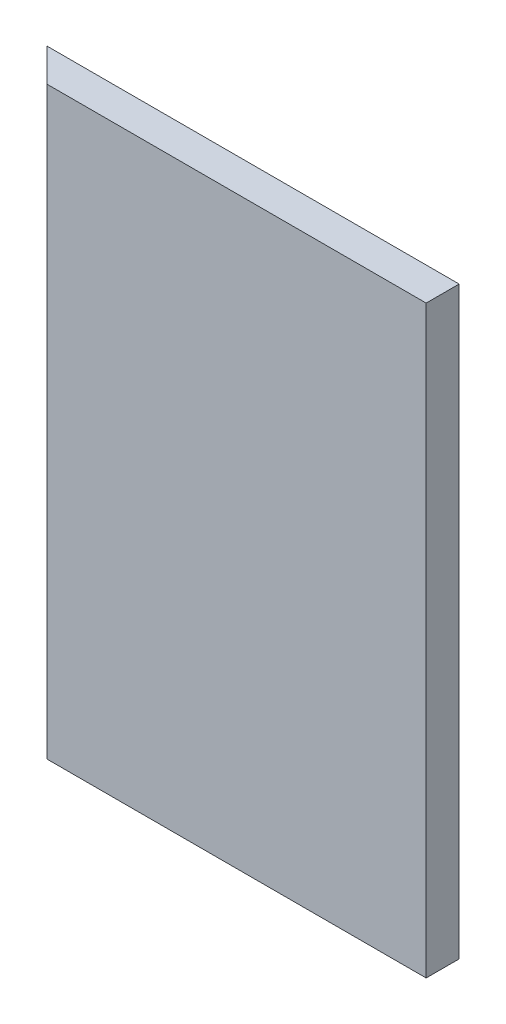
ISO-10303-21;
HEADER;
FILE_DESCRIPTION(('STEP AP214'),'2;1');
FILE_NAME('part.step','',(''),(''),'','','');
FILE_SCHEMA(('AUTOMOTIVE_DESIGN { 1 0 10303 214 1 1 1 1 }'));
ENDSEC;
DATA;
#1=APPLICATION_CONTEXT('core data for automotive mechanical design processes');
#2=APPLICATION_PROTOCOL_DEFINITION('international standard','automotive_design',2000,#1);
#3=PRODUCT_CONTEXT('',#1,'mechanical');
#4=PRODUCT('Part','Part','',(#3));
#5=PRODUCT_RELATED_PRODUCT_CATEGORY('part','',(#4));
#6=PRODUCT_DEFINITION_FORMATION('','',#4);
#7=PRODUCT_DEFINITION_CONTEXT('part definition',#1,'design');
#8=PRODUCT_DEFINITION('design','',#6,#7);
#9=PRODUCT_DEFINITION_SHAPE('','',#8);
#10=(LENGTH_UNIT() NAMED_UNIT(*) SI_UNIT(.MILLI.,.METRE.));
#11=(NAMED_UNIT(*) PLANE_ANGLE_UNIT() SI_UNIT($,.RADIAN.));
#12=(NAMED_UNIT(*) SI_UNIT($,.STERADIAN.) SOLID_ANGLE_UNIT());
#13=UNCERTAINTY_MEASURE_WITH_UNIT(LENGTH_MEASURE(1.E-05),#10,'distance_accuracy_value','');
#14=(GEOMETRIC_REPRESENTATION_CONTEXT(3) GLOBAL_UNCERTAINTY_ASSIGNED_CONTEXT((#13)) GLOBAL_UNIT_ASSIGNED_CONTEXT((#10,
#11,#12)) REPRESENTATION_CONTEXT('',''));
#15=CARTESIAN_POINT('',(0.,0.,0.));
#16=DIRECTION('',(0.,0.,1.));
#17=DIRECTION('',(1.,0.,0.));
#18=AXIS2_PLACEMENT_3D('',#15,#16,#17);
#19=CARTESIAN_POINT('',(-225.,-319.,36.));
#20=DIRECTION('',(0.,1.,0.));
#21=DIRECTION('',(0.,0.,1.));
#22=AXIS2_PLACEMENT_3D('',#19,#20,#21);
#23=PLANE('',#22);
#24=DIRECTION('',(1.,0.,0.));
#25=VECTOR('',#24,1.);
#26=CARTESIAN_POINT('',(-225.,-319.,36.));
#27=LINE('',#26,#25);
#28=CARTESIAN_POINT('',(-189.,-319.,36.));
#29=VERTEX_POINT('',#28);
#30=CARTESIAN_POINT('',(225.,-319.,36.));
#31=VERTEX_POINT('',#30);
#32=EDGE_CURVE('E118',#29,#31,#27,.T.);
#33=ORIENTED_EDGE('',*,*,#32,.F.);
#34=DIRECTION('',(-0.707106781186544,0.,-0.707106781186551));
#35=VECTOR('',#34,1.);
#36=CARTESIAN_POINT('',(-207.,-319.,18.));
#37=LINE('',#36,#35);
#38=CARTESIAN_POINT('',(-225.,-319.,0.));
#39=VERTEX_POINT('',#38);
#40=EDGE_CURVE('E110',#29,#39,#37,.T.);
#41=ORIENTED_EDGE('',*,*,#40,.T.);
#42=DIRECTION('',(1.,0.,0.));
#43=VECTOR('',#42,1.);
#44=CARTESIAN_POINT('',(-225.,-319.,0.));
#45=LINE('',#44,#43);
#46=CARTESIAN_POINT('',(225.,-319.,0.));
#47=VERTEX_POINT('',#46);
#48=EDGE_CURVE('E117',#39,#47,#45,.T.);
#49=ORIENTED_EDGE('',*,*,#48,.T.);
#50=DIRECTION('',(0.,0.,-1.));
#51=VECTOR('',#50,1.);
#52=CARTESIAN_POINT('',(225.,-319.,36.));
#53=LINE('',#52,#51);
#54=EDGE_CURVE('E101',#31,#47,#53,.T.);
#55=ORIENTED_EDGE('',*,*,#54,.F.);
#56=EDGE_LOOP('',(#33,#41,#49,#55));
#57=FACE_BOUND('',#56,.T.);
#58=ADVANCED_FACE('F17',(#57),#23,.F.);
#59=CARTESIAN_POINT('',(225.,-319.,36.));
#60=DIRECTION('',(-1.,0.,0.));
#61=DIRECTION('',(0.,0.,1.));
#62=AXIS2_PLACEMENT_3D('',#59,#60,#61);
#63=PLANE('',#62);
#64=DIRECTION('',(0.,1.,0.));
#65=VECTOR('',#64,1.);
#66=CARTESIAN_POINT('',(225.,-319.,0.));
#67=LINE('',#66,#65);
#68=CARTESIAN_POINT('',(225.,319.,0.));
#69=VERTEX_POINT('',#68);
#70=EDGE_CURVE('E127',#47,#69,#67,.T.);
#71=ORIENTED_EDGE('',*,*,#70,.T.);
#72=DIRECTION('',(0.,0.,-1.));
#73=VECTOR('',#72,1.);
#74=CARTESIAN_POINT('',(225.,319.,36.));
#75=LINE('',#74,#73);
#76=CARTESIAN_POINT('',(225.,319.,36.));
#77=VERTEX_POINT('',#76);
#78=EDGE_CURVE('E124',#77,#69,#75,.T.);
#79=ORIENTED_EDGE('',*,*,#78,.F.);
#80=DIRECTION('',(0.,1.,0.));
#81=VECTOR('',#80,1.);
#82=CARTESIAN_POINT('',(225.,-319.,36.));
#83=LINE('',#82,#81);
#84=EDGE_CURVE('E120',#31,#77,#83,.T.);
#85=ORIENTED_EDGE('',*,*,#84,.F.);
#86=ORIENTED_EDGE('',*,*,#54,.T.);
#87=EDGE_LOOP('',(#71,#79,#85,#86));
#88=FACE_BOUND('',#87,.T.);
#89=ADVANCED_FACE('F139',(#88),#63,.F.);
#90=CARTESIAN_POINT('',(225.,319.,36.));
#91=DIRECTION('',(0.,-1.,0.));
#92=DIRECTION('',(0.,0.,-1.));
#93=AXIS2_PLACEMENT_3D('',#90,#91,#92);
#94=PLANE('',#93);
#95=DIRECTION('',(-1.,0.,0.));
#96=VECTOR('',#95,1.);
#97=CARTESIAN_POINT('',(225.,319.,0.));
#98=LINE('',#97,#96);
#99=CARTESIAN_POINT('',(-225.,319.,0.));
#100=VERTEX_POINT('',#99);
#101=EDGE_CURVE('E129',#69,#100,#98,.T.);
#102=ORIENTED_EDGE('',*,*,#101,.T.);
#103=DIRECTION('',(-0.707106781186544,0.,-0.707106781186551));
#104=VECTOR('',#103,1.);
#105=CARTESIAN_POINT('',(-225.,319.,0.));
#106=LINE('',#105,#104);
#107=CARTESIAN_POINT('',(-189.,319.,36.));
#108=VERTEX_POINT('',#107);
#109=EDGE_CURVE('E108',#108,#100,#106,.T.);
#110=ORIENTED_EDGE('',*,*,#109,.F.);
#111=DIRECTION('',(-1.,0.,0.));
#112=VECTOR('',#111,1.);
#113=CARTESIAN_POINT('',(225.,319.,36.));
#114=LINE('',#113,#112);
#115=EDGE_CURVE('E106',#77,#108,#114,.T.);
#116=ORIENTED_EDGE('',*,*,#115,.F.);
#117=ORIENTED_EDGE('',*,*,#78,.T.);
#118=EDGE_LOOP('',(#102,#110,#116,#117));
#119=FACE_BOUND('',#118,.T.);
#120=ADVANCED_FACE('F149',(#119),#94,.F.);
#121=CARTESIAN_POINT('',(0.,0.,36.));
#122=DIRECTION('',(0.,0.,1.));
#123=DIRECTION('',(1.,0.,0.));
#124=AXIS2_PLACEMENT_3D('',#121,#122,#123);
#125=PLANE('',#124);
#126=DIRECTION('',(0.,1.,0.));
#127=VECTOR('',#126,1.);
#128=CARTESIAN_POINT('',(-189.,-601.,36.));
#129=LINE('',#128,#127);
#130=CARTESIAN_POINT('',(-189.,-15.,36.));
#131=VERTEX_POINT('',#130);
#132=EDGE_CURVE('E107',#29,#131,#129,.T.);
#133=ORIENTED_EDGE('',*,*,#132,.F.);
#134=ORIENTED_EDGE('',*,*,#32,.T.);
#135=ORIENTED_EDGE('',*,*,#84,.T.);
#136=ORIENTED_EDGE('',*,*,#115,.T.);
#137=CARTESIAN_POINT('',(-189.,15.,36.));
#138=VERTEX_POINT('',#137);
#139=EDGE_CURVE('E99',#138,#108,#129,.T.);
#140=ORIENTED_EDGE('',*,*,#139,.F.);
#141=DIRECTION('',(0.,1.,0.));
#142=VECTOR('',#141,1.);
#143=CARTESIAN_POINT('',(-189.,15.,36.));
#144=LINE('',#143,#142);
#145=EDGE_CURVE('E87',#131,#138,#144,.T.);
#146=ORIENTED_EDGE('',*,*,#145,.F.);
#147=EDGE_LOOP('',(#133,#134,#135,#136,#140,#146));
#148=FACE_BOUND('',#147,.T.);
#149=ADVANCED_FACE('F104',(#148),#125,.T.);
#150=CARTESIAN_POINT('',(0.,0.,0.));
#151=DIRECTION('',(0.,0.,1.));
#152=DIRECTION('',(1.,0.,0.));
#153=AXIS2_PLACEMENT_3D('',#150,#151,#152);
#154=PLANE('',#153);
#155=DIRECTION('',(1.,0.,0.));
#156=VECTOR('',#155,1.);
#157=CARTESIAN_POINT('',(0.,-15.,0.));
#158=LINE('',#157,#156);
#159=CARTESIAN_POINT('',(-204.,-15.,0.));
#160=VERTEX_POINT('',#159);
#161=CARTESIAN_POINT('',(-189.,-15.,0.));
#162=VERTEX_POINT('',#161);
#163=EDGE_CURVE('E156',#160,#162,#158,.T.);
#164=ORIENTED_EDGE('',*,*,#163,.T.);
#165=DIRECTION('',(0.,1.,0.));
#166=VECTOR('',#165,1.);
#167=CARTESIAN_POINT('',(-189.,0.,0.));
#168=LINE('',#167,#166);
#169=CARTESIAN_POINT('',(-189.,15.,0.));
#170=VERTEX_POINT('',#169);
#171=EDGE_CURVE('E111',#162,#170,#168,.T.);
#172=ORIENTED_EDGE('',*,*,#171,.T.);
#173=DIRECTION('',(-1.,0.,0.));
#174=VECTOR('',#173,1.);
#175=CARTESIAN_POINT('',(0.,15.,0.));
#176=LINE('',#175,#174);
#177=CARTESIAN_POINT('',(-204.,15.,0.));
#178=VERTEX_POINT('',#177);
#179=EDGE_CURVE('E85',#170,#178,#176,.T.);
#180=ORIENTED_EDGE('',*,*,#179,.T.);
#181=DIRECTION('',(0.,-1.,0.));
#182=VECTOR('',#181,1.);
#183=CARTESIAN_POINT('',(-204.,0.,0.));
#184=LINE('',#183,#182);
#185=EDGE_CURVE('E164',#178,#160,#184,.T.);
#186=ORIENTED_EDGE('',*,*,#185,.T.);
#187=EDGE_LOOP('',(#164,#172,#180,#186));
#188=FACE_BOUND('',#187,.T.);
#189=ORIENTED_EDGE('',*,*,#48,.F.);
#190=DIRECTION('',(0.,-1.,0.));
#191=VECTOR('',#190,1.);
#192=CARTESIAN_POINT('',(-225.,319.,0.));
#193=LINE('',#192,#191);
#194=EDGE_CURVE('E121',#100,#39,#193,.T.);
#195=ORIENTED_EDGE('',*,*,#194,.F.);
#196=ORIENTED_EDGE('',*,*,#101,.F.);
#197=ORIENTED_EDGE('',*,*,#70,.F.);
#198=EDGE_LOOP('',(#189,#195,#196,#197));
#199=FACE_BOUND('',#198,.T.);
#200=ADVANCED_FACE('F146',(#188,#199),#154,.F.);
#201=CARTESIAN_POINT('',(-225.,-601.,0.));
#202=DIRECTION('',(0.707106781186551,0.,-0.707106781186544));
#203=DIRECTION('',(-0.707106781186544,0.,-0.707106781186551));
#204=AXIS2_PLACEMENT_3D('',#201,#202,#203);
#205=PLANE('',#204);
#206=ORIENTED_EDGE('',*,*,#132,.T.);
#207=DIRECTION('',(-0.707106781186544,0.,-0.707106781186551));
#208=VECTOR('',#207,1.);
#209=CARTESIAN_POINT('',(-225.,-15.,2.37194523281895E-13));
#210=LINE('',#209,#208);
#211=CARTESIAN_POINT('',(-204.,-15.,21.));
#212=VERTEX_POINT('',#211);
#213=EDGE_CURVE('E11',#131,#212,#210,.T.);
#214=ORIENTED_EDGE('',*,*,#213,.T.);
#215=DIRECTION('',(0.,1.,0.));
#216=VECTOR('',#215,1.);
#217=CARTESIAN_POINT('',(-204.,-601.,21.));
#218=LINE('',#217,#216);
#219=CARTESIAN_POINT('',(-204.,15.,21.));
#220=VERTEX_POINT('',#219);
#221=EDGE_CURVE('E24',#212,#220,#218,.T.);
#222=ORIENTED_EDGE('',*,*,#221,.T.);
#223=DIRECTION('',(0.707106781186544,0.,0.707106781186551));
#224=VECTOR('',#223,1.);
#225=CARTESIAN_POINT('',(-225.,15.,0.));
#226=LINE('',#225,#224);
#227=EDGE_CURVE('E83',#220,#138,#226,.T.);
#228=ORIENTED_EDGE('',*,*,#227,.T.);
#229=ORIENTED_EDGE('',*,*,#139,.T.);
#230=ORIENTED_EDGE('',*,*,#109,.T.);
#231=ORIENTED_EDGE('',*,*,#194,.T.);
#232=ORIENTED_EDGE('',*,*,#40,.F.);
#233=EDGE_LOOP('',(#206,#214,#222,#228,#229,#230,#231,#232));
#234=FACE_BOUND('',#233,.T.);
#235=ADVANCED_FACE('F98',(#234),#205,.F.);
#236=CARTESIAN_POINT('',(-189.,15.,-40.));
#237=DIRECTION('',(1.,0.,0.));
#238=DIRECTION('',(0.,0.,-1.));
#239=AXIS2_PLACEMENT_3D('',#236,#237,#238);
#240=PLANE('',#239);
#241=DIRECTION('',(0.,0.,1.));
#242=VECTOR('',#241,1.);
#243=CARTESIAN_POINT('',(-189.,-15.,-40.));
#244=LINE('',#243,#242);
#245=EDGE_CURVE('E39',#162,#131,#244,.T.);
#246=ORIENTED_EDGE('',*,*,#245,.T.);
#247=ORIENTED_EDGE('',*,*,#145,.T.);
#248=DIRECTION('',(0.,0.,1.));
#249=VECTOR('',#248,1.);
#250=CARTESIAN_POINT('',(-189.,15.,-40.));
#251=LINE('',#250,#249);
#252=EDGE_CURVE('E80',#170,#138,#251,.T.);
#253=ORIENTED_EDGE('',*,*,#252,.F.);
#254=ORIENTED_EDGE('',*,*,#171,.F.);
#255=EDGE_LOOP('',(#246,#247,#253,#254));
#256=FACE_BOUND('',#255,.T.);
#257=ADVANCED_FACE('F90',(#256),#240,.F.);
#258=CARTESIAN_POINT('',(-204.,-15.,-40.));
#259=DIRECTION('',(0.,-1.,0.));
#260=DIRECTION('',(1.,0.,0.));
#261=AXIS2_PLACEMENT_3D('',#258,#259,#260);
#262=PLANE('',#261);
#263=DIRECTION('',(0.,0.,1.));
#264=VECTOR('',#263,1.);
#265=CARTESIAN_POINT('',(-204.,-15.,-40.));
#266=LINE('',#265,#264);
#267=EDGE_CURVE('E155',#160,#212,#266,.T.);
#268=ORIENTED_EDGE('',*,*,#267,.T.);
#269=ORIENTED_EDGE('',*,*,#213,.F.);
#270=ORIENTED_EDGE('',*,*,#245,.F.);
#271=ORIENTED_EDGE('',*,*,#163,.F.);
#272=EDGE_LOOP('',(#268,#269,#270,#271));
#273=FACE_BOUND('',#272,.T.);
#274=ADVANCED_FACE('F152',(#273),#262,.F.);
#275=CARTESIAN_POINT('',(-204.,15.,-40.));
#276=DIRECTION('',(-1.,0.,0.));
#277=DIRECTION('',(0.,0.,1.));
#278=AXIS2_PLACEMENT_3D('',#275,#276,#277);
#279=PLANE('',#278);
#280=DIRECTION('',(0.,0.,1.));
#281=VECTOR('',#280,1.);
#282=CARTESIAN_POINT('',(-204.,15.,-40.));
#283=LINE('',#282,#281);
#284=EDGE_CURVE('E31',#178,#220,#283,.T.);
#285=ORIENTED_EDGE('',*,*,#284,.T.);
#286=ORIENTED_EDGE('',*,*,#221,.F.);
#287=ORIENTED_EDGE('',*,*,#267,.F.);
#288=ORIENTED_EDGE('',*,*,#185,.F.);
#289=EDGE_LOOP('',(#285,#286,#287,#288));
#290=FACE_BOUND('',#289,.T.);
#291=ADVANCED_FACE('F167',(#290),#279,.F.);
#292=CARTESIAN_POINT('',(-204.,15.,-40.));
#293=DIRECTION('',(0.,1.,0.));
#294=DIRECTION('',(0.,0.,1.));
#295=AXIS2_PLACEMENT_3D('',#292,#293,#294);
#296=PLANE('',#295);
#297=ORIENTED_EDGE('',*,*,#252,.T.);
#298=ORIENTED_EDGE('',*,*,#227,.F.);
#299=ORIENTED_EDGE('',*,*,#284,.F.);
#300=ORIENTED_EDGE('',*,*,#179,.F.);
#301=EDGE_LOOP('',(#297,#298,#299,#300));
#302=FACE_BOUND('',#301,.T.);
#303=ADVANCED_FACE('F81',(#302),#296,.F.);
#304=CLOSED_SHELL('',(#58,#89,#120,#149,#200,#235,#257,#274,#291,#303));
#305=MANIFOLD_SOLID_BREP('B1',#304);
#306=ADVANCED_BREP_SHAPE_REPRESENTATION('',(#18,#305),#14);
#307=SHAPE_DEFINITION_REPRESENTATION(#9,#306);
ENDSEC;
END-ISO-10303-21;
